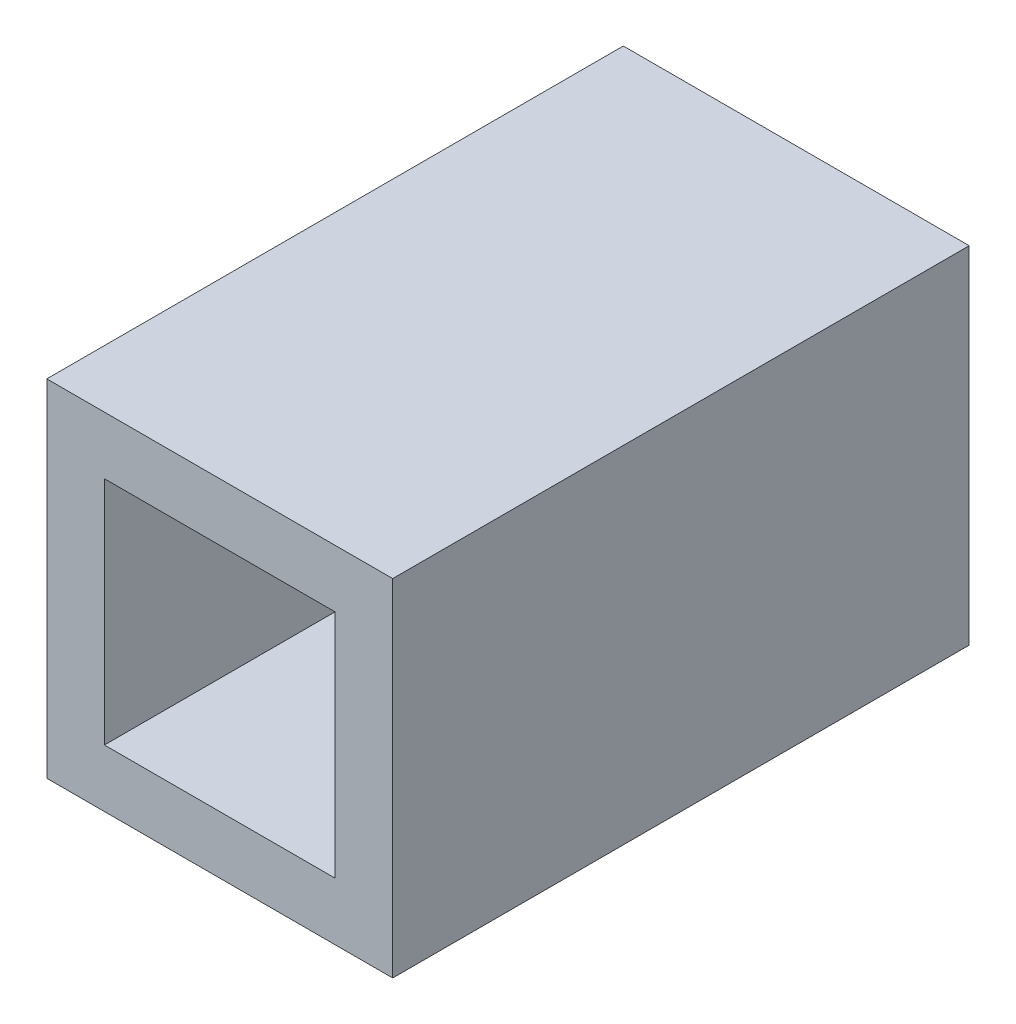
ISO-10303-21;
HEADER;
FILE_DESCRIPTION(('STEP AP214'),'2;1');
FILE_NAME('part.step','',(''),(''),'','','');
FILE_SCHEMA(('AUTOMOTIVE_DESIGN { 1 0 10303 214 1 1 1 1 }'));
ENDSEC;
DATA;
#1=APPLICATION_CONTEXT('core data for automotive mechanical design processes');
#2=APPLICATION_PROTOCOL_DEFINITION('international standard','automotive_design',2000,#1);
#3=PRODUCT_CONTEXT('',#1,'mechanical');
#4=PRODUCT('Part','Part','',(#3));
#5=PRODUCT_RELATED_PRODUCT_CATEGORY('part','',(#4));
#6=PRODUCT_DEFINITION_FORMATION('','',#4);
#7=PRODUCT_DEFINITION_CONTEXT('part definition',#1,'design');
#8=PRODUCT_DEFINITION('design','',#6,#7);
#9=PRODUCT_DEFINITION_SHAPE('','',#8);
#10=(LENGTH_UNIT() NAMED_UNIT(*) SI_UNIT(.MILLI.,.METRE.));
#11=(NAMED_UNIT(*) PLANE_ANGLE_UNIT() SI_UNIT($,.RADIAN.));
#12=(NAMED_UNIT(*) SI_UNIT($,.STERADIAN.) SOLID_ANGLE_UNIT());
#13=UNCERTAINTY_MEASURE_WITH_UNIT(LENGTH_MEASURE(1.E-05),#10,'distance_accuracy_value','');
#14=(GEOMETRIC_REPRESENTATION_CONTEXT(3) GLOBAL_UNCERTAINTY_ASSIGNED_CONTEXT((#13)) GLOBAL_UNIT_ASSIGNED_CONTEXT((#10,
#11,#12)) REPRESENTATION_CONTEXT('',''));
#15=CARTESIAN_POINT('',(0.,0.,0.));
#16=DIRECTION('',(0.,0.,1.));
#17=DIRECTION('',(1.,0.,0.));
#18=AXIS2_PLACEMENT_3D('',#15,#16,#17);
#19=CARTESIAN_POINT('',(30.,30.,0.));
#20=DIRECTION('',(0.,0.,1.));
#21=DIRECTION('',(0.,-1.,0.));
#22=AXIS2_PLACEMENT_3D('',#19,#20,#21);
#23=PLANE('',#22);
#24=DIRECTION('',(0.,1.,0.));
#25=VECTOR('',#24,1.);
#26=CARTESIAN_POINT('',(-30.,30.,0.));
#27=LINE('',#26,#25);
#28=CARTESIAN_POINT('',(-30.,-30.,0.));
#29=VERTEX_POINT('',#28);
#30=CARTESIAN_POINT('',(-30.,30.,0.));
#31=VERTEX_POINT('',#30);
#32=EDGE_CURVE('E137',#29,#31,#27,.T.);
#33=ORIENTED_EDGE('',*,*,#32,.T.);
#34=DIRECTION('',(-1.,0.,0.));
#35=VECTOR('',#34,1.);
#36=CARTESIAN_POINT('',(30.,30.,0.));
#37=LINE('',#36,#35);
#38=CARTESIAN_POINT('',(30.,30.,0.));
#39=VERTEX_POINT('',#38);
#40=EDGE_CURVE('E11',#39,#31,#37,.T.);
#41=ORIENTED_EDGE('',*,*,#40,.F.);
#42=DIRECTION('',(0.,1.,0.));
#43=VECTOR('',#42,1.);
#44=CARTESIAN_POINT('',(30.,30.,0.));
#45=LINE('',#44,#43);
#46=CARTESIAN_POINT('',(30.,-30.,0.));
#47=VERTEX_POINT('',#46);
#48=EDGE_CURVE('E141',#47,#39,#45,.T.);
#49=ORIENTED_EDGE('',*,*,#48,.F.);
#50=DIRECTION('',(-1.,0.,0.));
#51=VECTOR('',#50,1.);
#52=CARTESIAN_POINT('',(30.,-30.,0.));
#53=LINE('',#52,#51);
#54=EDGE_CURVE('E152',#47,#29,#53,.T.);
#55=ORIENTED_EDGE('',*,*,#54,.T.);
#56=EDGE_LOOP('',(#33,#41,#49,#55));
#57=FACE_BOUND('',#56,.T.);
#58=DIRECTION('',(0.,1.,0.));
#59=VECTOR('',#58,1.);
#60=CARTESIAN_POINT('',(-20.,20.,0.));
#61=LINE('',#60,#59);
#62=CARTESIAN_POINT('',(-20.,-20.,0.));
#63=VERTEX_POINT('',#62);
#64=CARTESIAN_POINT('',(-20.,20.,0.));
#65=VERTEX_POINT('',#64);
#66=EDGE_CURVE('E109',#63,#65,#61,.T.);
#67=ORIENTED_EDGE('',*,*,#66,.F.);
#68=DIRECTION('',(1.,0.,0.));
#69=VECTOR('',#68,1.);
#70=CARTESIAN_POINT('',(-20.,-20.,0.));
#71=LINE('',#70,#69);
#72=CARTESIAN_POINT('',(20.,-20.,0.));
#73=VERTEX_POINT('',#72);
#74=EDGE_CURVE('E140',#63,#73,#71,.T.);
#75=ORIENTED_EDGE('',*,*,#74,.T.);
#76=DIRECTION('',(0.,1.,0.));
#77=VECTOR('',#76,1.);
#78=CARTESIAN_POINT('',(20.,20.,0.));
#79=LINE('',#78,#77);
#80=CARTESIAN_POINT('',(20.,20.,0.));
#81=VERTEX_POINT('',#80);
#82=EDGE_CURVE('E119',#73,#81,#79,.T.);
#83=ORIENTED_EDGE('',*,*,#82,.T.);
#84=DIRECTION('',(1.,0.,0.));
#85=VECTOR('',#84,1.);
#86=CARTESIAN_POINT('',(-20.,20.,0.));
#87=LINE('',#86,#85);
#88=EDGE_CURVE('E131',#65,#81,#87,.T.);
#89=ORIENTED_EDGE('',*,*,#88,.F.);
#90=EDGE_LOOP('',(#67,#75,#83,#89));
#91=FACE_BOUND('',#90,.T.);
#92=ADVANCED_FACE('F39',(#57,#91),#23,.F.);
#93=CARTESIAN_POINT('',(30.,30.,100.));
#94=DIRECTION('',(0.,0.,-1.));
#95=DIRECTION('',(-1.,0.,0.));
#96=AXIS2_PLACEMENT_3D('',#93,#94,#95);
#97=PLANE('',#96);
#98=DIRECTION('',(0.,-1.,0.));
#99=VECTOR('',#98,1.);
#100=CARTESIAN_POINT('',(-30.,30.,100.));
#101=LINE('',#100,#99);
#102=CARTESIAN_POINT('',(-30.,30.,100.));
#103=VERTEX_POINT('',#102);
#104=CARTESIAN_POINT('',(-30.,-30.,100.));
#105=VERTEX_POINT('',#104);
#106=EDGE_CURVE('E157',#103,#105,#101,.T.);
#107=ORIENTED_EDGE('',*,*,#106,.T.);
#108=DIRECTION('',(-1.,0.,0.));
#109=VECTOR('',#108,1.);
#110=CARTESIAN_POINT('',(30.,-30.,100.));
#111=LINE('',#110,#109);
#112=CARTESIAN_POINT('',(30.,-30.,100.));
#113=VERTEX_POINT('',#112);
#114=EDGE_CURVE('E162',#113,#105,#111,.T.);
#115=ORIENTED_EDGE('',*,*,#114,.F.);
#116=DIRECTION('',(0.,-1.,0.));
#117=VECTOR('',#116,1.);
#118=CARTESIAN_POINT('',(30.,30.,100.));
#119=LINE('',#118,#117);
#120=CARTESIAN_POINT('',(30.,30.,100.));
#121=VERTEX_POINT('',#120);
#122=EDGE_CURVE('E150',#121,#113,#119,.T.);
#123=ORIENTED_EDGE('',*,*,#122,.F.);
#124=DIRECTION('',(-1.,0.,0.));
#125=VECTOR('',#124,1.);
#126=CARTESIAN_POINT('',(30.,30.,100.));
#127=LINE('',#126,#125);
#128=EDGE_CURVE('E46',#121,#103,#127,.T.);
#129=ORIENTED_EDGE('',*,*,#128,.T.);
#130=EDGE_LOOP('',(#107,#115,#123,#129));
#131=FACE_BOUND('',#130,.T.);
#132=DIRECTION('',(0.,-1.,0.));
#133=VECTOR('',#132,1.);
#134=CARTESIAN_POINT('',(-20.,20.,100.));
#135=LINE('',#134,#133);
#136=CARTESIAN_POINT('',(-20.,20.,100.));
#137=VERTEX_POINT('',#136);
#138=CARTESIAN_POINT('',(-20.,-20.,100.));
#139=VERTEX_POINT('',#138);
#140=EDGE_CURVE('E116',#137,#139,#135,.T.);
#141=ORIENTED_EDGE('',*,*,#140,.F.);
#142=DIRECTION('',(1.,0.,0.));
#143=VECTOR('',#142,1.);
#144=CARTESIAN_POINT('',(-20.,20.,100.));
#145=LINE('',#144,#143);
#146=CARTESIAN_POINT('',(20.,20.,100.));
#147=VERTEX_POINT('',#146);
#148=EDGE_CURVE('E102',#137,#147,#145,.T.);
#149=ORIENTED_EDGE('',*,*,#148,.T.);
#150=DIRECTION('',(0.,-1.,0.));
#151=VECTOR('',#150,1.);
#152=CARTESIAN_POINT('',(20.,20.,100.));
#153=LINE('',#152,#151);
#154=CARTESIAN_POINT('',(20.,-20.,100.));
#155=VERTEX_POINT('',#154);
#156=EDGE_CURVE('E128',#147,#155,#153,.T.);
#157=ORIENTED_EDGE('',*,*,#156,.T.);
#158=DIRECTION('',(1.,0.,0.));
#159=VECTOR('',#158,1.);
#160=CARTESIAN_POINT('',(-20.,-20.,100.));
#161=LINE('',#160,#159);
#162=EDGE_CURVE('E110',#139,#155,#161,.T.);
#163=ORIENTED_EDGE('',*,*,#162,.F.);
#164=EDGE_LOOP('',(#141,#149,#157,#163));
#165=FACE_BOUND('',#164,.T.);
#166=ADVANCED_FACE('F125',(#131,#165),#97,.F.);
#167=CARTESIAN_POINT('',(30.,30.,0.));
#168=DIRECTION('',(0.,-1.,0.));
#169=DIRECTION('',(0.,0.,-1.));
#170=AXIS2_PLACEMENT_3D('',#167,#168,#169);
#171=PLANE('',#170);
#172=DIRECTION('',(0.,0.,1.));
#173=VECTOR('',#172,1.);
#174=CARTESIAN_POINT('',(-30.,30.,0.));
#175=LINE('',#174,#173);
#176=EDGE_CURVE('E151',#31,#103,#175,.T.);
#177=ORIENTED_EDGE('',*,*,#176,.T.);
#178=ORIENTED_EDGE('',*,*,#128,.F.);
#179=DIRECTION('',(0.,0.,1.));
#180=VECTOR('',#179,1.);
#181=CARTESIAN_POINT('',(30.,30.,0.));
#182=LINE('',#181,#180);
#183=EDGE_CURVE('E143',#39,#121,#182,.T.);
#184=ORIENTED_EDGE('',*,*,#183,.F.);
#185=ORIENTED_EDGE('',*,*,#40,.T.);
#186=EDGE_LOOP('',(#177,#178,#184,#185));
#187=FACE_BOUND('',#186,.T.);
#188=ADVANCED_FACE('F185',(#187),#171,.F.);
#189=CARTESIAN_POINT('',(30.,-30.,0.));
#190=DIRECTION('',(0.,1.,0.));
#191=DIRECTION('',(0.,0.,1.));
#192=AXIS2_PLACEMENT_3D('',#189,#190,#191);
#193=PLANE('',#192);
#194=DIRECTION('',(0.,0.,-1.));
#195=VECTOR('',#194,1.);
#196=CARTESIAN_POINT('',(-30.,-30.,0.));
#197=LINE('',#196,#195);
#198=EDGE_CURVE('E145',#105,#29,#197,.T.);
#199=ORIENTED_EDGE('',*,*,#198,.T.);
#200=ORIENTED_EDGE('',*,*,#54,.F.);
#201=DIRECTION('',(0.,0.,-1.));
#202=VECTOR('',#201,1.);
#203=CARTESIAN_POINT('',(30.,-30.,0.));
#204=LINE('',#203,#202);
#205=EDGE_CURVE('E146',#113,#47,#204,.T.);
#206=ORIENTED_EDGE('',*,*,#205,.F.);
#207=ORIENTED_EDGE('',*,*,#114,.T.);
#208=EDGE_LOOP('',(#199,#200,#206,#207));
#209=FACE_BOUND('',#208,.T.);
#210=ADVANCED_FACE('F177',(#209),#193,.F.);
#211=CARTESIAN_POINT('',(30.,0.,0.));
#212=DIRECTION('',(-1.,0.,0.));
#213=DIRECTION('',(0.,0.,1.));
#214=AXIS2_PLACEMENT_3D('',#211,#212,#213);
#215=PLANE('',#214);
#216=ORIENTED_EDGE('',*,*,#48,.T.);
#217=ORIENTED_EDGE('',*,*,#183,.T.);
#218=ORIENTED_EDGE('',*,*,#122,.T.);
#219=ORIENTED_EDGE('',*,*,#205,.T.);
#220=EDGE_LOOP('',(#216,#217,#218,#219));
#221=FACE_BOUND('',#220,.T.);
#222=ADVANCED_FACE('F181',(#221),#215,.F.);
#223=CARTESIAN_POINT('',(-30.,0.,0.));
#224=DIRECTION('',(-1.,0.,0.));
#225=DIRECTION('',(0.,0.,1.));
#226=AXIS2_PLACEMENT_3D('',#223,#224,#225);
#227=PLANE('',#226);
#228=ORIENTED_EDGE('',*,*,#32,.F.);
#229=ORIENTED_EDGE('',*,*,#198,.F.);
#230=ORIENTED_EDGE('',*,*,#106,.F.);
#231=ORIENTED_EDGE('',*,*,#176,.F.);
#232=EDGE_LOOP('',(#228,#229,#230,#231));
#233=FACE_BOUND('',#232,.T.);
#234=ADVANCED_FACE('F174',(#233),#227,.T.);
#235=CARTESIAN_POINT('',(-20.,20.,0.));
#236=DIRECTION('',(0.,1.,0.));
#237=DIRECTION('',(0.,0.,1.));
#238=AXIS2_PLACEMENT_3D('',#235,#236,#237);
#239=PLANE('',#238);
#240=DIRECTION('',(0.,0.,1.));
#241=VECTOR('',#240,1.);
#242=CARTESIAN_POINT('',(20.,20.,0.));
#243=LINE('',#242,#241);
#244=EDGE_CURVE('E52',#81,#147,#243,.T.);
#245=ORIENTED_EDGE('',*,*,#244,.T.);
#246=ORIENTED_EDGE('',*,*,#148,.F.);
#247=DIRECTION('',(0.,0.,1.));
#248=VECTOR('',#247,1.);
#249=CARTESIAN_POINT('',(-20.,20.,0.));
#250=LINE('',#249,#248);
#251=EDGE_CURVE('E101',#65,#137,#250,.T.);
#252=ORIENTED_EDGE('',*,*,#251,.F.);
#253=ORIENTED_EDGE('',*,*,#88,.T.);
#254=EDGE_LOOP('',(#245,#246,#252,#253));
#255=FACE_BOUND('',#254,.T.);
#256=ADVANCED_FACE('F104',(#255),#239,.F.);
#257=CARTESIAN_POINT('',(-20.,-20.,100.));
#258=DIRECTION('',(0.,-1.,0.));
#259=DIRECTION('',(0.,0.,-1.));
#260=AXIS2_PLACEMENT_3D('',#257,#258,#259);
#261=PLANE('',#260);
#262=DIRECTION('',(0.,0.,-1.));
#263=VECTOR('',#262,1.);
#264=CARTESIAN_POINT('',(20.,-20.,100.));
#265=LINE('',#264,#263);
#266=EDGE_CURVE('E59',#155,#73,#265,.T.);
#267=ORIENTED_EDGE('',*,*,#266,.T.);
#268=ORIENTED_EDGE('',*,*,#74,.F.);
#269=DIRECTION('',(0.,0.,-1.));
#270=VECTOR('',#269,1.);
#271=CARTESIAN_POINT('',(-20.,-20.,100.));
#272=LINE('',#271,#270);
#273=EDGE_CURVE('E123',#139,#63,#272,.T.);
#274=ORIENTED_EDGE('',*,*,#273,.F.);
#275=ORIENTED_EDGE('',*,*,#162,.T.);
#276=EDGE_LOOP('',(#267,#268,#274,#275));
#277=FACE_BOUND('',#276,.T.);
#278=ADVANCED_FACE('F212',(#277),#261,.F.);
#279=CARTESIAN_POINT('',(-20.,0.,0.));
#280=DIRECTION('',(1.,0.,0.));
#281=DIRECTION('',(0.,0.,-1.));
#282=AXIS2_PLACEMENT_3D('',#279,#280,#281);
#283=PLANE('',#282);
#284=ORIENTED_EDGE('',*,*,#251,.T.);
#285=ORIENTED_EDGE('',*,*,#140,.T.);
#286=ORIENTED_EDGE('',*,*,#273,.T.);
#287=ORIENTED_EDGE('',*,*,#66,.T.);
#288=EDGE_LOOP('',(#284,#285,#286,#287));
#289=FACE_BOUND('',#288,.T.);
#290=ADVANCED_FACE('F114',(#289),#283,.T.);
#291=CARTESIAN_POINT('',(20.,0.,0.));
#292=DIRECTION('',(1.,0.,0.));
#293=DIRECTION('',(0.,0.,-1.));
#294=AXIS2_PLACEMENT_3D('',#291,#292,#293);
#295=PLANE('',#294);
#296=ORIENTED_EDGE('',*,*,#244,.F.);
#297=ORIENTED_EDGE('',*,*,#82,.F.);
#298=ORIENTED_EDGE('',*,*,#266,.F.);
#299=ORIENTED_EDGE('',*,*,#156,.F.);
#300=EDGE_LOOP('',(#296,#297,#298,#299));
#301=FACE_BOUND('',#300,.T.);
#302=ADVANCED_FACE('F227',(#301),#295,.F.);
#303=CLOSED_SHELL('',(#92,#166,#188,#210,#222,#234,#256,#278,#290,#302));
#304=MANIFOLD_SOLID_BREP('B2',#303);
#305=ADVANCED_BREP_SHAPE_REPRESENTATION('',(#18,#304),#14);
#306=SHAPE_DEFINITION_REPRESENTATION(#9,#305);
ENDSEC;
END-ISO-10303-21;
